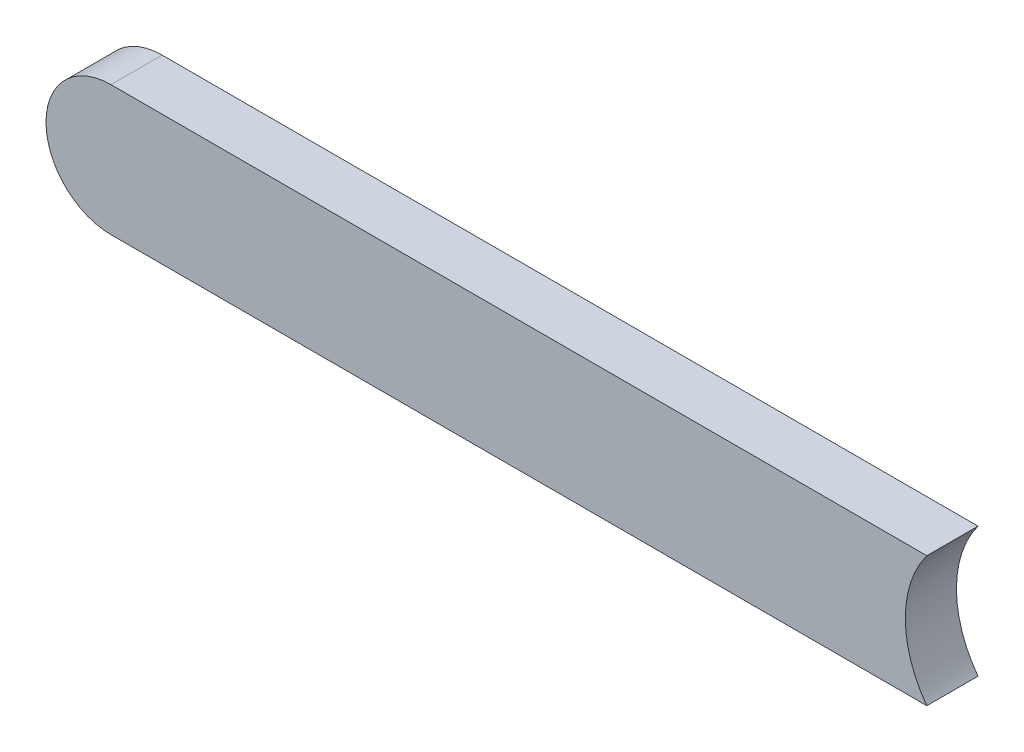
ISO-10303-21;
HEADER;
FILE_DESCRIPTION(('STEP AP214'),'2;1');
FILE_NAME('part.step','',(''),(''),'','','');
FILE_SCHEMA(('AUTOMOTIVE_DESIGN { 1 0 10303 214 1 1 1 1 }'));
ENDSEC;
DATA;
#1=APPLICATION_CONTEXT('core data for automotive mechanical design processes');
#2=APPLICATION_PROTOCOL_DEFINITION('international standard','automotive_design',2000,#1);
#3=PRODUCT_CONTEXT('',#1,'mechanical');
#4=PRODUCT('Part','Part','',(#3));
#5=PRODUCT_RELATED_PRODUCT_CATEGORY('part','',(#4));
#6=PRODUCT_DEFINITION_FORMATION('','',#4);
#7=PRODUCT_DEFINITION_CONTEXT('part definition',#1,'design');
#8=PRODUCT_DEFINITION('design','',#6,#7);
#9=PRODUCT_DEFINITION_SHAPE('','',#8);
#10=(LENGTH_UNIT() NAMED_UNIT(*) SI_UNIT(.MILLI.,.METRE.));
#11=(NAMED_UNIT(*) PLANE_ANGLE_UNIT() SI_UNIT($,.RADIAN.));
#12=(NAMED_UNIT(*) SI_UNIT($,.STERADIAN.) SOLID_ANGLE_UNIT());
#13=UNCERTAINTY_MEASURE_WITH_UNIT(LENGTH_MEASURE(1.E-05),#10,'distance_accuracy_value','');
#14=(GEOMETRIC_REPRESENTATION_CONTEXT(3) GLOBAL_UNCERTAINTY_ASSIGNED_CONTEXT((#13)) GLOBAL_UNIT_ASSIGNED_CONTEXT((#10,
#11,#12)) REPRESENTATION_CONTEXT('',''));
#15=CARTESIAN_POINT('',(0.,0.,0.));
#16=DIRECTION('',(0.,0.,1.));
#17=DIRECTION('',(1.,0.,0.));
#18=AXIS2_PLACEMENT_3D('',#15,#16,#17);
#19=CARTESIAN_POINT('',(128.5491968,118.491,0.));
#20=DIRECTION('',(0.,1.,0.));
#21=DIRECTION('',(1.,0.,0.));
#22=AXIS2_PLACEMENT_3D('',#19,#20,#21);
#23=PLANE('',#22);
#24=DIRECTION('',(1.,0.,0.));
#25=VECTOR('',#24,1.);
#26=CARTESIAN_POINT('',(128.5491968,118.491,0.1999996));
#27=LINE('',#26,#25);
#28=CARTESIAN_POINT('',(128.5491968,118.491,0.1999996));
#29=VERTEX_POINT('',#28);
#30=CARTESIAN_POINT('',(131.739251768897,118.491,0.1999996));
#31=VERTEX_POINT('',#30);
#32=EDGE_CURVE('E11',#29,#31,#27,.T.);
#33=ORIENTED_EDGE('',*,*,#32,.F.);
#34=DIRECTION('',(0.,0.,1.));
#35=VECTOR('',#34,1.);
#36=CARTESIAN_POINT('',(128.5491968,118.491,0.));
#37=LINE('',#36,#35);
#38=CARTESIAN_POINT('',(128.5491968,118.491,0.));
#39=VERTEX_POINT('',#38);
#40=EDGE_CURVE('E24',#39,#29,#37,.T.);
#41=ORIENTED_EDGE('',*,*,#40,.F.);
#42=DIRECTION('',(1.,0.,0.));
#43=VECTOR('',#42,1.);
#44=CARTESIAN_POINT('',(128.5491968,118.491,0.));
#45=LINE('',#44,#43);
#46=CARTESIAN_POINT('',(131.739251768897,118.491,0.));
#47=VERTEX_POINT('',#46);
#48=EDGE_CURVE('E75',#39,#47,#45,.T.);
#49=ORIENTED_EDGE('',*,*,#48,.T.);
#50=DIRECTION('',(0.,0.,1.));
#51=VECTOR('',#50,1.);
#52=CARTESIAN_POINT('',(131.739251768897,118.491,0.));
#53=LINE('',#52,#51);
#54=EDGE_CURVE('E37',#47,#31,#53,.T.);
#55=ORIENTED_EDGE('',*,*,#54,.T.);
#56=EDGE_LOOP('',(#33,#41,#49,#55));
#57=FACE_BOUND('',#56,.T.);
#58=ADVANCED_FACE('F17',(#57),#23,.F.);
#59=CARTESIAN_POINT('',(132.08,118.745,0.));
#60=DIRECTION('',(0.,0.,-1.));
#61=DIRECTION('',(1.,0.,0.));
#62=AXIS2_PLACEMENT_3D('',#59,#60,#61);
#63=CYLINDRICAL_SURFACE('',#62,0.42500042);
#64=DIRECTION('',(0.,0.,1.));
#65=VECTOR('',#64,1.);
#66=CARTESIAN_POINT('',(131.739251768897,118.999,0.));
#67=LINE('',#66,#65);
#68=CARTESIAN_POINT('',(131.739251768897,118.999,0.));
#69=VERTEX_POINT('',#68);
#70=CARTESIAN_POINT('',(131.739251768897,118.999,0.1999996));
#71=VERTEX_POINT('',#70);
#72=EDGE_CURVE('E67',#69,#71,#67,.T.);
#73=ORIENTED_EDGE('',*,*,#72,.T.);
#74=CARTESIAN_POINT('',(132.08,118.745,0.1999996));
#75=DIRECTION('',(0.,0.,1.));
#76=DIRECTION('',(1.,0.,0.));
#77=AXIS2_PLACEMENT_3D('',#74,#75,#76);
#78=CIRCLE('',#77,0.42500042);
#79=EDGE_CURVE('E82',#71,#31,#78,.T.);
#80=ORIENTED_EDGE('',*,*,#79,.T.);
#81=ORIENTED_EDGE('',*,*,#54,.F.);
#82=CARTESIAN_POINT('',(132.08,118.745,0.));
#83=DIRECTION('',(0.,0.,1.));
#84=DIRECTION('',(1.,0.,0.));
#85=AXIS2_PLACEMENT_3D('',#82,#83,#84);
#86=CIRCLE('',#85,0.42500042);
#87=EDGE_CURVE('E80',#69,#47,#86,.T.);
#88=ORIENTED_EDGE('',*,*,#87,.F.);
#89=EDGE_LOOP('',(#73,#80,#81,#88));
#90=FACE_BOUND('',#89,.T.);
#91=ADVANCED_FACE('F88',(#90),#63,.F.);
#92=CARTESIAN_POINT('',(131.739251768897,118.999,0.));
#93=DIRECTION('',(0.,-1.,0.));
#94=DIRECTION('',(-1.,0.,0.));
#95=AXIS2_PLACEMENT_3D('',#92,#93,#94);
#96=PLANE('',#95);
#97=DIRECTION('',(-1.,0.,0.));
#98=VECTOR('',#97,1.);
#99=CARTESIAN_POINT('',(132.08,118.999,0.1999996));
#100=LINE('',#99,#98);
#101=CARTESIAN_POINT('',(128.5491968,118.999,0.1999996));
#102=VERTEX_POINT('',#101);
#103=EDGE_CURVE('E71',#71,#102,#100,.T.);
#104=ORIENTED_EDGE('',*,*,#103,.F.);
#105=ORIENTED_EDGE('',*,*,#72,.F.);
#106=DIRECTION('',(-1.,0.,0.));
#107=VECTOR('',#106,1.);
#108=CARTESIAN_POINT('',(132.08,118.999,0.));
#109=LINE('',#108,#107);
#110=CARTESIAN_POINT('',(128.5491968,118.999,0.));
#111=VERTEX_POINT('',#110);
#112=EDGE_CURVE('E63',#69,#111,#109,.T.);
#113=ORIENTED_EDGE('',*,*,#112,.T.);
#114=DIRECTION('',(0.,0.,1.));
#115=VECTOR('',#114,1.);
#116=CARTESIAN_POINT('',(128.5491968,118.999,0.));
#117=LINE('',#116,#115);
#118=EDGE_CURVE('E53',#111,#102,#117,.T.);
#119=ORIENTED_EDGE('',*,*,#118,.T.);
#120=EDGE_LOOP('',(#104,#105,#113,#119));
#121=FACE_BOUND('',#120,.T.);
#122=ADVANCED_FACE('F66',(#121),#96,.F.);
#123=CARTESIAN_POINT('',(128.5491968,118.745,0.));
#124=DIRECTION('',(0.,0.,-1.));
#125=DIRECTION('',(-1.11896493820486E-13,1.,0.));
#126=AXIS2_PLACEMENT_3D('',#123,#124,#125);
#127=CYLINDRICAL_SURFACE('',#126,0.254000000000005);
#128=CARTESIAN_POINT('',(128.5491968,118.745,0.1999996));
#129=DIRECTION('',(0.,0.,1.));
#130=DIRECTION('',(-1.11896493820486E-13,1.,0.));
#131=AXIS2_PLACEMENT_3D('',#128,#129,#130);
#132=CIRCLE('',#131,0.254000000000005);
#133=EDGE_CURVE('E59',#102,#29,#132,.T.);
#134=ORIENTED_EDGE('',*,*,#133,.F.);
#135=ORIENTED_EDGE('',*,*,#118,.F.);
#136=CARTESIAN_POINT('',(128.5491968,118.745,0.));
#137=DIRECTION('',(0.,0.,1.));
#138=DIRECTION('',(-1.11896493820486E-13,1.,0.));
#139=AXIS2_PLACEMENT_3D('',#136,#137,#138);
#140=CIRCLE('',#139,0.254000000000005);
#141=EDGE_CURVE('E57',#111,#39,#140,.T.);
#142=ORIENTED_EDGE('',*,*,#141,.T.);
#143=ORIENTED_EDGE('',*,*,#40,.T.);
#144=EDGE_LOOP('',(#134,#135,#142,#143));
#145=FACE_BOUND('',#144,.T.);
#146=ADVANCED_FACE('F55',(#145),#127,.T.);
#147=CARTESIAN_POINT('',(128.5491968,118.491,0.));
#148=DIRECTION('',(0.,0.,-1.));
#149=DIRECTION('',(-1.,0.,0.));
#150=AXIS2_PLACEMENT_3D('',#147,#148,#149);
#151=PLANE('',#150);
#152=ORIENTED_EDGE('',*,*,#48,.F.);
#153=ORIENTED_EDGE('',*,*,#141,.F.);
#154=ORIENTED_EDGE('',*,*,#112,.F.);
#155=ORIENTED_EDGE('',*,*,#87,.T.);
#156=EDGE_LOOP('',(#152,#153,#154,#155));
#157=FACE_BOUND('',#156,.T.);
#158=ADVANCED_FACE('F74',(#157),#151,.T.);
#159=CARTESIAN_POINT('',(128.5491968,118.491,0.1999996));
#160=DIRECTION('',(0.,0.,-1.));
#161=DIRECTION('',(-1.,0.,0.));
#162=AXIS2_PLACEMENT_3D('',#159,#160,#161);
#163=PLANE('',#162);
#164=ORIENTED_EDGE('',*,*,#133,.T.);
#165=ORIENTED_EDGE('',*,*,#32,.T.);
#166=ORIENTED_EDGE('',*,*,#79,.F.);
#167=ORIENTED_EDGE('',*,*,#103,.T.);
#168=EDGE_LOOP('',(#164,#165,#166,#167));
#169=FACE_BOUND('',#168,.T.);
#170=ADVANCED_FACE('F91',(#169),#163,.F.);
#171=CLOSED_SHELL('',(#58,#91,#122,#146,#158,#170));
#172=MANIFOLD_SOLID_BREP('B1',#171);
#173=ADVANCED_BREP_SHAPE_REPRESENTATION('',(#18,#172),#14);
#174=SHAPE_DEFINITION_REPRESENTATION(#9,#173);
ENDSEC;
END-ISO-10303-21;
